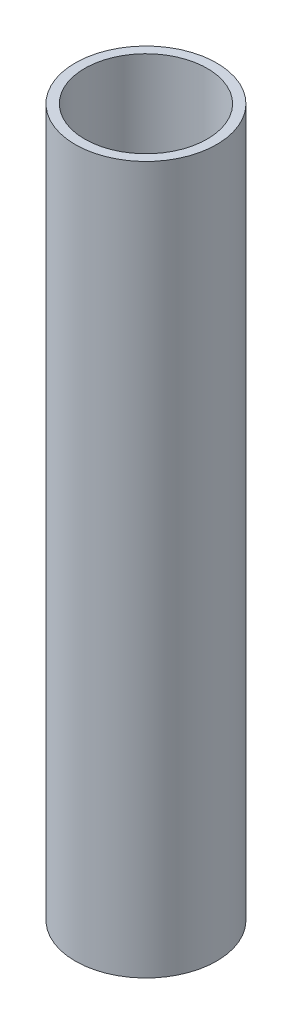
ISO-10303-21;
HEADER;
FILE_DESCRIPTION(('STEP AP214'),'2;1');
FILE_NAME('part.step','',(''),(''),'','','');
FILE_SCHEMA(('AUTOMOTIVE_DESIGN { 1 0 10303 214 1 1 1 1 }'));
ENDSEC;
DATA;
#1=APPLICATION_CONTEXT('core data for automotive mechanical design processes');
#2=APPLICATION_PROTOCOL_DEFINITION('international standard','automotive_design',2000,#1);
#3=PRODUCT_CONTEXT('',#1,'mechanical');
#4=PRODUCT('Part','Part','',(#3));
#5=PRODUCT_RELATED_PRODUCT_CATEGORY('part','',(#4));
#6=PRODUCT_DEFINITION_FORMATION('','',#4);
#7=PRODUCT_DEFINITION_CONTEXT('part definition',#1,'design');
#8=PRODUCT_DEFINITION('design','',#6,#7);
#9=PRODUCT_DEFINITION_SHAPE('','',#8);
#10=(LENGTH_UNIT() NAMED_UNIT(*) SI_UNIT(.MILLI.,.METRE.));
#11=(NAMED_UNIT(*) PLANE_ANGLE_UNIT() SI_UNIT($,.RADIAN.));
#12=(NAMED_UNIT(*) SI_UNIT($,.STERADIAN.) SOLID_ANGLE_UNIT());
#13=UNCERTAINTY_MEASURE_WITH_UNIT(LENGTH_MEASURE(1.E-05),#10,'distance_accuracy_value','');
#14=(GEOMETRIC_REPRESENTATION_CONTEXT(3) GLOBAL_UNCERTAINTY_ASSIGNED_CONTEXT((#13)) GLOBAL_UNIT_ASSIGNED_CONTEXT((#10,
#11,#12)) REPRESENTATION_CONTEXT('',''));
#15=CARTESIAN_POINT('',(0.,0.,0.));
#16=DIRECTION('',(0.,0.,1.));
#17=DIRECTION('',(1.,0.,0.));
#18=AXIS2_PLACEMENT_3D('',#15,#16,#17);
#19=CARTESIAN_POINT('',(0.,37.5,0.));
#20=DIRECTION('',(0.,1.,0.));
#21=DIRECTION('',(0.,0.,1.));
#22=AXIS2_PLACEMENT_3D('',#19,#20,#21);
#23=PLANE('',#22);
#24=CARTESIAN_POINT('',(0.,37.5,0.));
#25=DIRECTION('',(0.,1.,0.));
#26=DIRECTION('',(0.,0.,1.));
#27=AXIS2_PLACEMENT_3D('',#24,#25,#26);
#28=CIRCLE('',#27,7.5);
#29=CARTESIAN_POINT('',(0.,37.5,7.5));
#30=VERTEX_POINT('',#29);
#31=EDGE_CURVE('E10',#30,#30,#28,.T.);
#32=ORIENTED_EDGE('',*,*,#31,.T.);
#33=EDGE_LOOP('',(#32));
#34=FACE_BOUND('',#33,.T.);
#35=CARTESIAN_POINT('',(0.,37.5,0.));
#36=DIRECTION('',(0.,1.,0.));
#37=DIRECTION('',(0.,0.,1.));
#38=AXIS2_PLACEMENT_3D('',#35,#36,#37);
#39=CIRCLE('',#38,6.5);
#40=CARTESIAN_POINT('',(0.,37.5,6.5));
#41=VERTEX_POINT('',#40);
#42=EDGE_CURVE('E50',#41,#41,#39,.T.);
#43=ORIENTED_EDGE('',*,*,#42,.F.);
#44=EDGE_LOOP('',(#43));
#45=FACE_BOUND('',#44,.T.);
#46=ADVANCED_FACE('F37',(#34,#45),#23,.T.);
#47=CARTESIAN_POINT('',(0.,-37.5,0.));
#48=DIRECTION('',(0.,1.,0.));
#49=DIRECTION('',(0.,0.,1.));
#50=AXIS2_PLACEMENT_3D('',#47,#48,#49);
#51=PLANE('',#50);
#52=CARTESIAN_POINT('',(0.,-37.5,0.));
#53=DIRECTION('',(0.,1.,0.));
#54=DIRECTION('',(0.,0.,1.));
#55=AXIS2_PLACEMENT_3D('',#52,#53,#54);
#56=CIRCLE('',#55,7.5);
#57=CARTESIAN_POINT('',(0.,-37.5,7.5));
#58=VERTEX_POINT('',#57);
#59=EDGE_CURVE('E41',#58,#58,#56,.T.);
#60=ORIENTED_EDGE('',*,*,#59,.F.);
#61=EDGE_LOOP('',(#60));
#62=FACE_BOUND('',#61,.T.);
#63=CARTESIAN_POINT('',(0.,-37.5,0.));
#64=DIRECTION('',(0.,1.,0.));
#65=DIRECTION('',(0.,0.,1.));
#66=AXIS2_PLACEMENT_3D('',#63,#64,#65);
#67=CIRCLE('',#66,6.5);
#68=CARTESIAN_POINT('',(0.,-37.5,6.5));
#69=VERTEX_POINT('',#68);
#70=EDGE_CURVE('E52',#69,#69,#67,.T.);
#71=ORIENTED_EDGE('',*,*,#70,.T.);
#72=EDGE_LOOP('',(#71));
#73=FACE_BOUND('',#72,.T.);
#74=ADVANCED_FACE('F64',(#62,#73),#51,.F.);
#75=CARTESIAN_POINT('',(0.,37.5,0.));
#76=DIRECTION('',(0.,-1.,0.));
#77=DIRECTION('',(0.,0.,-1.));
#78=AXIS2_PLACEMENT_3D('',#75,#76,#77);
#79=CYLINDRICAL_SURFACE('',#78,7.5);
#80=ORIENTED_EDGE('',*,*,#31,.F.);
#81=EDGE_LOOP('',(#80));
#82=FACE_BOUND('',#81,.T.);
#83=ORIENTED_EDGE('',*,*,#59,.T.);
#84=EDGE_LOOP('',(#83));
#85=FACE_BOUND('',#84,.T.);
#86=ADVANCED_FACE('F39',(#82,#85),#79,.T.);
#87=CARTESIAN_POINT('',(0.,37.5,0.));
#88=DIRECTION('',(0.,-1.,0.));
#89=DIRECTION('',(0.,0.,-1.));
#90=AXIS2_PLACEMENT_3D('',#87,#88,#89);
#91=CYLINDRICAL_SURFACE('',#90,6.5);
#92=ORIENTED_EDGE('',*,*,#42,.T.);
#93=EDGE_LOOP('',(#92));
#94=FACE_BOUND('',#93,.T.);
#95=ORIENTED_EDGE('',*,*,#70,.F.);
#96=EDGE_LOOP('',(#95));
#97=FACE_BOUND('',#96,.T.);
#98=ADVANCED_FACE('F60',(#94,#97),#91,.F.);
#99=CLOSED_SHELL('',(#46,#74,#86,#98));
#100=MANIFOLD_SOLID_BREP('B2',#99);
#101=ADVANCED_BREP_SHAPE_REPRESENTATION('',(#18,#100),#14);
#102=SHAPE_DEFINITION_REPRESENTATION(#9,#101);
ENDSEC;
END-ISO-10303-21;
